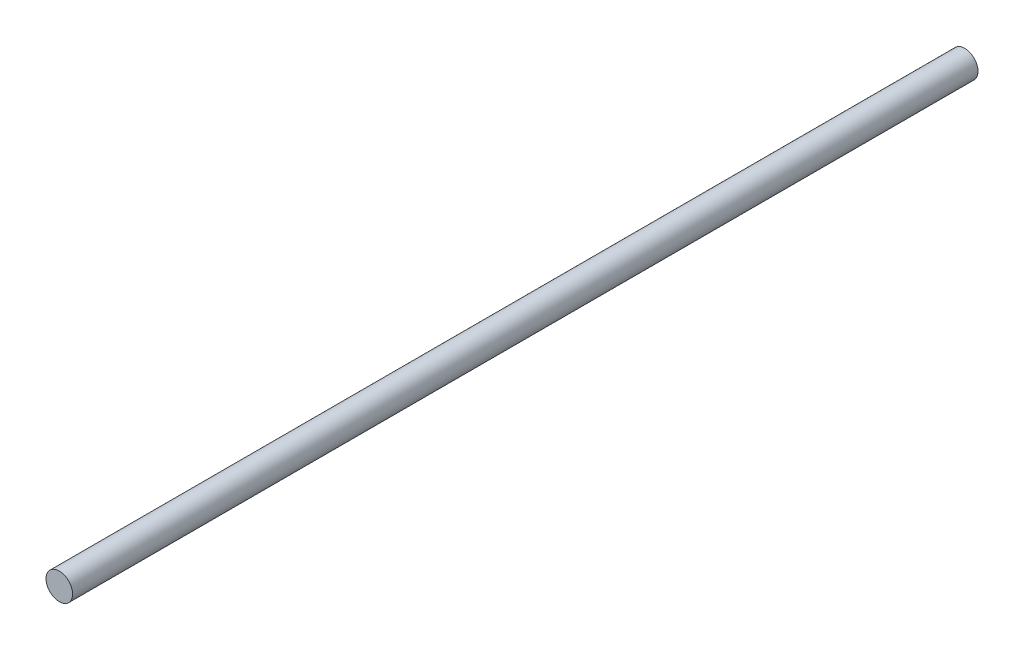
ISO-10303-21;
HEADER;
FILE_DESCRIPTION(('STEP AP214'),'2;1');
FILE_NAME('part.step','',(''),(''),'','','');
FILE_SCHEMA(('AUTOMOTIVE_DESIGN { 1 0 10303 214 1 1 1 1 }'));
ENDSEC;
DATA;
#1=APPLICATION_CONTEXT('core data for automotive mechanical design processes');
#2=APPLICATION_PROTOCOL_DEFINITION('international standard','automotive_design',2000,#1);
#3=PRODUCT_CONTEXT('',#1,'mechanical');
#4=PRODUCT('Part','Part','',(#3));
#5=PRODUCT_RELATED_PRODUCT_CATEGORY('part','',(#4));
#6=PRODUCT_DEFINITION_FORMATION('','',#4);
#7=PRODUCT_DEFINITION_CONTEXT('part definition',#1,'design');
#8=PRODUCT_DEFINITION('design','',#6,#7);
#9=PRODUCT_DEFINITION_SHAPE('','',#8);
#10=(LENGTH_UNIT() NAMED_UNIT(*) SI_UNIT(.MILLI.,.METRE.));
#11=(NAMED_UNIT(*) PLANE_ANGLE_UNIT() SI_UNIT($,.RADIAN.));
#12=(NAMED_UNIT(*) SI_UNIT($,.STERADIAN.) SOLID_ANGLE_UNIT());
#13=UNCERTAINTY_MEASURE_WITH_UNIT(LENGTH_MEASURE(1.E-05),#10,'distance_accuracy_value','');
#14=(GEOMETRIC_REPRESENTATION_CONTEXT(3) GLOBAL_UNCERTAINTY_ASSIGNED_CONTEXT((#13)) GLOBAL_UNIT_ASSIGNED_CONTEXT((#10,
#11,#12)) REPRESENTATION_CONTEXT('',''));
#15=CARTESIAN_POINT('',(0.,0.,0.));
#16=DIRECTION('',(0.,0.,1.));
#17=DIRECTION('',(1.,0.,0.));
#18=AXIS2_PLACEMENT_3D('',#15,#16,#17);
#19=CARTESIAN_POINT('',(0.,0.,432.562));
#20=DIRECTION('',(0.,0.,-1.));
#21=DIRECTION('',(-1.,0.,0.));
#22=AXIS2_PLACEMENT_3D('',#19,#20,#21);
#23=CYLINDRICAL_SURFACE('',#22,6.35);
#24=CARTESIAN_POINT('',(0.,0.,432.562));
#25=DIRECTION('',(0.,0.,1.));
#26=DIRECTION('',(1.,0.,0.));
#27=AXIS2_PLACEMENT_3D('',#24,#25,#26);
#28=CIRCLE('',#27,6.35);
#29=CARTESIAN_POINT('',(-6.35,0.,432.562));
#30=VERTEX_POINT('',#29);
#31=EDGE_CURVE('E10',#30,#30,#28,.T.);
#32=CARTESIAN_POINT('',(0.,0.,0.));
#33=DIRECTION('',(0.,0.,1.));
#34=DIRECTION('',(1.,0.,0.));
#35=AXIS2_PLACEMENT_3D('',#32,#33,#34);
#36=CIRCLE('',#35,6.35);
#37=CARTESIAN_POINT('',(-6.35,0.,0.));
#38=VERTEX_POINT('',#37);
#39=EDGE_CURVE('E40',#38,#38,#36,.T.);
#40=CARTESIAN_POINT('',(-6.35,0.,432.562));
#41=CARTESIAN_POINT('',(-6.35,0.,428.056145833333));
#42=CARTESIAN_POINT('',(-6.35,0.,423.550291666667));
#43=CARTESIAN_POINT('',(-6.35,0.,414.538583333333));
#44=CARTESIAN_POINT('',(-6.35,0.,410.032729166667));
#45=CARTESIAN_POINT('',(-6.35,0.,401.021020833333));
#46=CARTESIAN_POINT('',(-6.35,0.,396.515166666667));
#47=CARTESIAN_POINT('',(-6.35,0.,387.503458333333));
#48=CARTESIAN_POINT('',(-6.35,0.,382.997604166667));
#49=CARTESIAN_POINT('',(-6.35,0.,373.985895833333));
#50=CARTESIAN_POINT('',(-6.35,0.,369.480041666667));
#51=CARTESIAN_POINT('',(-6.35,0.,360.468333333333));
#52=CARTESIAN_POINT('',(-6.35,0.,355.962479166667));
#53=CARTESIAN_POINT('',(-6.35,0.,346.950770833333));
#54=CARTESIAN_POINT('',(-6.35,0.,342.444916666667));
#55=CARTESIAN_POINT('',(-6.35,0.,333.433208333333));
#56=CARTESIAN_POINT('',(-6.35,0.,328.927354166667));
#57=CARTESIAN_POINT('',(-6.35,0.,319.915645833333));
#58=CARTESIAN_POINT('',(-6.35,0.,315.409791666667));
#59=CARTESIAN_POINT('',(-6.35,0.,306.398083333333));
#60=CARTESIAN_POINT('',(-6.35,0.,301.892229166667));
#61=CARTESIAN_POINT('',(-6.35,0.,292.880520833333));
#62=CARTESIAN_POINT('',(-6.35,0.,288.374666666667));
#63=CARTESIAN_POINT('',(-6.35,0.,279.362958333333));
#64=CARTESIAN_POINT('',(-6.35,0.,274.857104166667));
#65=CARTESIAN_POINT('',(-6.35,0.,265.845395833333));
#66=CARTESIAN_POINT('',(-6.35,0.,261.339541666667));
#67=CARTESIAN_POINT('',(-6.35,0.,252.327833333333));
#68=CARTESIAN_POINT('',(-6.35,0.,247.821979166667));
#69=CARTESIAN_POINT('',(-6.35,0.,238.810270833333));
#70=CARTESIAN_POINT('',(-6.35,0.,234.304416666667));
#71=CARTESIAN_POINT('',(-6.35,0.,225.292708333333));
#72=CARTESIAN_POINT('',(-6.35,0.,220.786854166667));
#73=CARTESIAN_POINT('',(-6.35,0.,211.775145833333));
#74=CARTESIAN_POINT('',(-6.35,0.,207.269291666667));
#75=CARTESIAN_POINT('',(-6.35,0.,198.257583333333));
#76=CARTESIAN_POINT('',(-6.35,0.,193.751729166667));
#77=CARTESIAN_POINT('',(-6.35,0.,184.740020833333));
#78=CARTESIAN_POINT('',(-6.35,0.,180.234166666667));
#79=CARTESIAN_POINT('',(-6.35,0.,171.222458333333));
#80=CARTESIAN_POINT('',(-6.35,0.,166.716604166667));
#81=CARTESIAN_POINT('',(-6.35,0.,157.704895833333));
#82=CARTESIAN_POINT('',(-6.35,0.,153.199041666667));
#83=CARTESIAN_POINT('',(-6.35,0.,144.187333333333));
#84=CARTESIAN_POINT('',(-6.35,0.,139.681479166667));
#85=CARTESIAN_POINT('',(-6.35,0.,130.669770833333));
#86=CARTESIAN_POINT('',(-6.35,0.,126.163916666667));
#87=CARTESIAN_POINT('',(-6.35,0.,117.152208333333));
#88=CARTESIAN_POINT('',(-6.35,0.,112.646354166667));
#89=CARTESIAN_POINT('',(-6.35,0.,103.634645833333));
#90=CARTESIAN_POINT('',(-6.35,0.,99.1287916666666));
#91=CARTESIAN_POINT('',(-6.35,0.,90.1170833333333));
#92=CARTESIAN_POINT('',(-6.35,0.,85.6112291666666));
#93=CARTESIAN_POINT('',(-6.35,0.,76.5995208333333));
#94=CARTESIAN_POINT('',(-6.35,0.,72.0936666666666));
#95=CARTESIAN_POINT('',(-6.35,0.,63.0819583333333));
#96=CARTESIAN_POINT('',(-6.35,0.,58.5761041666666));
#97=CARTESIAN_POINT('',(-6.35,0.,49.5643958333333));
#98=CARTESIAN_POINT('',(-6.35,0.,45.0585416666666));
#99=CARTESIAN_POINT('',(-6.35,0.,36.0468333333333));
#100=CARTESIAN_POINT('',(-6.35,0.,31.5409791666666));
#101=CARTESIAN_POINT('',(-6.35,0.,22.5292708333333));
#102=CARTESIAN_POINT('',(-6.35,0.,18.0234166666666));
#103=CARTESIAN_POINT('',(-6.35,0.,9.0117083333333));
#104=CARTESIAN_POINT('',(-6.35,0.,4.50585416666662));
#105=CARTESIAN_POINT('',(-6.35,0.,0.));
#106=B_SPLINE_CURVE_WITH_KNOTS('',3,(#40,#41,#42,#43,#44,#45,#46,#47,#48,#49,#50,#51,#52,#53,
#54,#55,#56,#57,#58,#59,#60,#61,#62,#63,#64,#65,#66,#67,#68,#69,#70,#71,#72,#73,#74,#75,#76,#77,
#78,#79,#80,#81,#82,#83,#84,#85,#86,#87,#88,#89,#90,#91,#92,#93,#94,#95,#96,#97,#98,#99,#100,
#101,#102,#103,#104,#105),.UNSPECIFIED.,.F.,.F.,(4,2,2,2,2,2,2,2,2,2,2,2,2,2,2,2,2,2,2,2,2,2,2,
2,2,2,2,2,2,2,2,2,4),(0.,13.5175625,27.035125,40.5526875,54.07025,67.5878125,81.105375,
94.6229375,108.1405,121.6580625,135.175625,148.6931875,162.21075,175.7283125,189.245875,
202.7634375,216.281,229.7985625,243.316125,256.8336875,270.35125,283.8688125,297.386375,
310.9039375,324.4215,337.9390625,351.456625,364.9741875,378.49175,392.0093125,405.526875,
419.0444375,432.562),.UNSPECIFIED.);
#107=EDGE_CURVE('BSEAM37',#30,#38,#106,.T.);
#108=ORIENTED_EDGE('',*,*,#31,.F.);
#109=ORIENTED_EDGE('',*,*,#39,.T.);
#110=ORIENTED_EDGE('',*,*,#107,.T.);
#111=ORIENTED_EDGE('',*,*,#107,.F.);
#112=EDGE_LOOP('',(#108,#110,#109,#111));
#113=FACE_BOUND('',#112,.T.);
#114=ADVANCED_FACE('F37',(#113),#23,.T.);
#115=CARTESIAN_POINT('',(0.,0.,432.562));
#116=DIRECTION('',(0.,0.,1.));
#117=DIRECTION('',(1.,0.,0.));
#118=AXIS2_PLACEMENT_3D('',#115,#116,#117);
#119=PLANE('',#118);
#120=ORIENTED_EDGE('',*,*,#31,.T.);
#121=EDGE_LOOP('',(#120));
#122=FACE_BOUND('',#121,.T.);
#123=ADVANCED_FACE('F54',(#122),#119,.T.);
#124=CARTESIAN_POINT('',(0.,0.,0.));
#125=DIRECTION('',(0.,0.,1.));
#126=DIRECTION('',(1.,0.,0.));
#127=AXIS2_PLACEMENT_3D('',#124,#125,#126);
#128=PLANE('',#127);
#129=ORIENTED_EDGE('',*,*,#39,.F.);
#130=EDGE_LOOP('',(#129));
#131=FACE_BOUND('',#130,.T.);
#132=ADVANCED_FACE('F52',(#131),#128,.F.);
#133=CLOSED_SHELL('',(#114,#123,#132));
#134=MANIFOLD_SOLID_BREP('B2',#133);
#135=ADVANCED_BREP_SHAPE_REPRESENTATION('',(#18,#134),#14);
#136=SHAPE_DEFINITION_REPRESENTATION(#9,#135);
ENDSEC;
END-ISO-10303-21;
